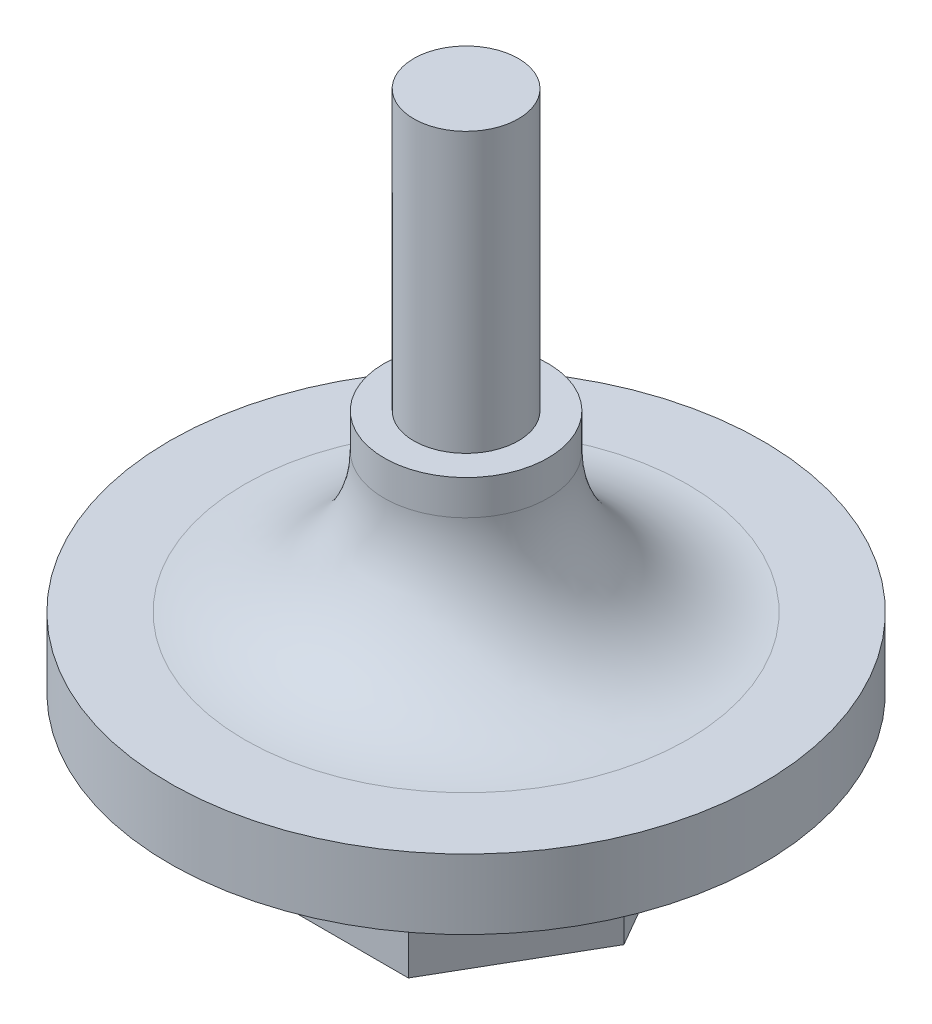
ISO-10303-21;
HEADER;
FILE_DESCRIPTION(('STEP AP214'),'2;1');
FILE_NAME('part.step','',(''),(''),'','','');
FILE_SCHEMA(('AUTOMOTIVE_DESIGN { 1 0 10303 214 1 1 1 1 }'));
ENDSEC;
DATA;
#1=APPLICATION_CONTEXT('core data for automotive mechanical design processes');
#2=APPLICATION_PROTOCOL_DEFINITION('international standard','automotive_design',2000,#1);
#3=PRODUCT_CONTEXT('',#1,'mechanical');
#4=PRODUCT('Part','Part','',(#3));
#5=PRODUCT_RELATED_PRODUCT_CATEGORY('part','',(#4));
#6=PRODUCT_DEFINITION_FORMATION('','',#4);
#7=PRODUCT_DEFINITION_CONTEXT('part definition',#1,'design');
#8=PRODUCT_DEFINITION('design','',#6,#7);
#9=PRODUCT_DEFINITION_SHAPE('','',#8);
#10=(LENGTH_UNIT() NAMED_UNIT(*) SI_UNIT(.MILLI.,.METRE.));
#11=(NAMED_UNIT(*) PLANE_ANGLE_UNIT() SI_UNIT($,.RADIAN.));
#12=(NAMED_UNIT(*) SI_UNIT($,.STERADIAN.) SOLID_ANGLE_UNIT());
#13=UNCERTAINTY_MEASURE_WITH_UNIT(LENGTH_MEASURE(1.E-05),#10,'distance_accuracy_value','');
#14=(GEOMETRIC_REPRESENTATION_CONTEXT(3) GLOBAL_UNCERTAINTY_ASSIGNED_CONTEXT((#13)) GLOBAL_UNIT_ASSIGNED_CONTEXT((#10,
#11,#12)) REPRESENTATION_CONTEXT('',''));
#15=CARTESIAN_POINT('',(0.,0.,0.));
#16=DIRECTION('',(0.,0.,1.));
#17=DIRECTION('',(1.,0.,0.));
#18=AXIS2_PLACEMENT_3D('',#15,#16,#17);
#19=CARTESIAN_POINT('',(0.,0.,0.));
#20=DIRECTION('',(0.,1.,0.));
#21=DIRECTION('',(-1.,0.,0.));
#22=AXIS2_PLACEMENT_3D('',#19,#20,#21);
#23=PLANE('',#22);
#24=CARTESIAN_POINT('',(0.,0.,0.));
#25=DIRECTION('',(0.,1.,0.));
#26=DIRECTION('',(-1.,0.,0.));
#27=AXIS2_PLACEMENT_3D('',#24,#25,#26);
#28=CIRCLE('',#27,13.5);
#29=CARTESIAN_POINT('',(-13.5,0.,0.));
#30=VERTEX_POINT('',#29);
#31=EDGE_CURVE('E111',#30,#30,#28,.T.);
#32=ORIENTED_EDGE('',*,*,#31,.F.);
#33=EDGE_LOOP('',(#32));
#34=FACE_BOUND('',#33,.T.);
#35=DIRECTION('',(0.5,0.,0.866025403784439));
#36=VECTOR('',#35,1.);
#37=CARTESIAN_POINT('',(3.59285072516704,0.,-6.223));
#38=LINE('',#37,#36);
#39=CARTESIAN_POINT('',(3.59285072516704,0.,-6.223));
#40=VERTEX_POINT('',#39);
#41=CARTESIAN_POINT('',(7.18570145033408,0.,0.));
#42=VERTEX_POINT('',#41);
#43=EDGE_CURVE('E53',#40,#42,#38,.T.);
#44=ORIENTED_EDGE('',*,*,#43,.F.);
#45=DIRECTION('',(1.,0.,0.));
#46=VECTOR('',#45,1.);
#47=CARTESIAN_POINT('',(-3.59285072516704,0.,-6.223));
#48=LINE('',#47,#46);
#49=CARTESIAN_POINT('',(-3.59285072516704,0.,-6.223));
#50=VERTEX_POINT('',#49);
#51=EDGE_CURVE('E57',#50,#40,#48,.T.);
#52=ORIENTED_EDGE('',*,*,#51,.F.);
#53=DIRECTION('',(0.5,0.,-0.866025403784438));
#54=VECTOR('',#53,1.);
#55=CARTESIAN_POINT('',(-7.18570145033408,0.,0.));
#56=LINE('',#55,#54);
#57=CARTESIAN_POINT('',(-7.18570145033408,0.,0.));
#58=VERTEX_POINT('',#57);
#59=EDGE_CURVE('E288',#58,#50,#56,.T.);
#60=ORIENTED_EDGE('',*,*,#59,.F.);
#61=DIRECTION('',(-0.5,0.,-0.866025403784438));
#62=VECTOR('',#61,1.);
#63=CARTESIAN_POINT('',(-3.59285072516704,0.,6.223));
#64=LINE('',#63,#62);
#65=CARTESIAN_POINT('',(-3.59285072516704,0.,6.223));
#66=VERTEX_POINT('',#65);
#67=EDGE_CURVE('E303',#66,#58,#64,.T.);
#68=ORIENTED_EDGE('',*,*,#67,.F.);
#69=DIRECTION('',(-1.,0.,0.));
#70=VECTOR('',#69,1.);
#71=CARTESIAN_POINT('',(3.59285072516704,0.,6.223));
#72=LINE('',#71,#70);
#73=CARTESIAN_POINT('',(3.59285072516704,0.,6.223));
#74=VERTEX_POINT('',#73);
#75=EDGE_CURVE('E306',#74,#66,#72,.T.);
#76=ORIENTED_EDGE('',*,*,#75,.F.);
#77=DIRECTION('',(-0.5,0.,0.866025403784438));
#78=VECTOR('',#77,1.);
#79=CARTESIAN_POINT('',(7.18570145033408,0.,0.));
#80=LINE('',#79,#78);
#81=EDGE_CURVE('E307',#42,#74,#80,.T.);
#82=ORIENTED_EDGE('',*,*,#81,.F.);
#83=EDGE_LOOP('',(#44,#52,#60,#68,#76,#82));
#84=FACE_BOUND('',#83,.T.);
#85=ADVANCED_FACE('F38',(#34,#84),#23,.F.);
#86=CARTESIAN_POINT('',(2.38125,23.8125,0.));
#87=DIRECTION('',(0.,-1.,0.));
#88=DIRECTION('',(1.,0.,0.));
#89=AXIS2_PLACEMENT_3D('',#86,#87,#88);
#90=PLANE('',#89);
#91=CARTESIAN_POINT('',(0.,23.8125,0.));
#92=DIRECTION('',(0.,1.,0.));
#93=DIRECTION('',(-1.,0.,0.));
#94=AXIS2_PLACEMENT_3D('',#91,#92,#93);
#95=CIRCLE('',#94,2.38125000000001);
#96=CARTESIAN_POINT('',(-2.38125000000001,23.8125,0.));
#97=VERTEX_POINT('',#96);
#98=EDGE_CURVE('E11',#97,#97,#95,.T.);
#99=ORIENTED_EDGE('',*,*,#98,.T.);
#100=EDGE_LOOP('',(#99));
#101=FACE_BOUND('',#100,.T.);
#102=ADVANCED_FACE('F40',(#101),#90,.F.);
#103=CARTESIAN_POINT('',(0.,23.8125,0.));
#104=DIRECTION('',(0.,1.,0.));
#105=DIRECTION('',(-1.,0.,0.));
#106=AXIS2_PLACEMENT_3D('',#103,#104,#105);
#107=CYLINDRICAL_SURFACE('',#106,2.38125000000001);
#108=ORIENTED_EDGE('',*,*,#98,.F.);
#109=EDGE_LOOP('',(#108));
#110=FACE_BOUND('',#109,.T.);
#111=CARTESIAN_POINT('',(0.,11.1125,0.));
#112=DIRECTION('',(0.,1.,0.));
#113=DIRECTION('',(-1.,0.,0.));
#114=AXIS2_PLACEMENT_3D('',#111,#112,#113);
#115=CIRCLE('',#114,2.38125000000001);
#116=CARTESIAN_POINT('',(-2.38125000000001,11.1125,0.));
#117=VERTEX_POINT('',#116);
#118=EDGE_CURVE('E46',#117,#117,#115,.T.);
#119=ORIENTED_EDGE('',*,*,#118,.T.);
#120=EDGE_LOOP('',(#119));
#121=FACE_BOUND('',#120,.T.);
#122=ADVANCED_FACE('F133',(#110,#121),#107,.T.);
#123=CARTESIAN_POINT('',(3.73,11.1125,0.));
#124=DIRECTION('',(0.,-1.,0.));
#125=DIRECTION('',(1.,0.,0.));
#126=AXIS2_PLACEMENT_3D('',#123,#124,#125);
#127=PLANE('',#126);
#128=ORIENTED_EDGE('',*,*,#118,.F.);
#129=EDGE_LOOP('',(#128));
#130=FACE_BOUND('',#129,.T.);
#131=CARTESIAN_POINT('',(0.,11.1125,0.));
#132=DIRECTION('',(0.,1.,0.));
#133=DIRECTION('',(-1.,0.,0.));
#134=AXIS2_PLACEMENT_3D('',#131,#132,#133);
#135=CIRCLE('',#134,3.73);
#136=CARTESIAN_POINT('',(-3.73,11.1125,0.));
#137=VERTEX_POINT('',#136);
#138=EDGE_CURVE('E128',#137,#137,#135,.T.);
#139=ORIENTED_EDGE('',*,*,#138,.T.);
#140=EDGE_LOOP('',(#139));
#141=FACE_BOUND('',#140,.T.);
#142=ADVANCED_FACE('F135',(#130,#141),#127,.F.);
#143=CARTESIAN_POINT('',(0.,23.8125,0.));
#144=DIRECTION('',(0.,1.,0.));
#145=DIRECTION('',(-1.,0.,0.));
#146=AXIS2_PLACEMENT_3D('',#143,#144,#145);
#147=CYLINDRICAL_SURFACE('',#146,3.73);
#148=ORIENTED_EDGE('',*,*,#138,.F.);
#149=EDGE_LOOP('',(#148));
#150=FACE_BOUND('',#149,.T.);
#151=CARTESIAN_POINT('',(0.,9.525,0.));
#152=DIRECTION('',(0.,1.,0.));
#153=DIRECTION('',(-1.,0.,0.));
#154=AXIS2_PLACEMENT_3D('',#151,#152,#153);
#155=CIRCLE('',#154,3.73);
#156=CARTESIAN_POINT('',(-3.73,9.525,0.));
#157=VERTEX_POINT('',#156);
#158=EDGE_CURVE('E125',#157,#157,#155,.T.);
#159=ORIENTED_EDGE('',*,*,#158,.T.);
#160=EDGE_LOOP('',(#159));
#161=FACE_BOUND('',#160,.T.);
#162=ADVANCED_FACE('F138',(#150,#161),#147,.T.);
#163=CARTESIAN_POINT('',(0.,9.525,0.));
#164=DIRECTION('',(0.,1.,0.));
#165=DIRECTION('',(-1.,0.,0.));
#166=AXIS2_PLACEMENT_3D('',#163,#164,#165);
#167=TOROIDAL_SURFACE('',#166,10.08,6.35);
#168=ORIENTED_EDGE('',*,*,#158,.F.);
#169=EDGE_LOOP('',(#168));
#170=FACE_BOUND('',#169,.T.);
#171=CARTESIAN_POINT('',(0.,3.175,0.));
#172=DIRECTION('',(0.,1.,0.));
#173=DIRECTION('',(-1.,0.,0.));
#174=AXIS2_PLACEMENT_3D('',#171,#172,#173);
#175=CIRCLE('',#174,10.08);
#176=CARTESIAN_POINT('',(-10.08,3.175,0.));
#177=VERTEX_POINT('',#176);
#178=EDGE_CURVE('E122',#177,#177,#175,.T.);
#179=ORIENTED_EDGE('',*,*,#178,.T.);
#180=EDGE_LOOP('',(#179));
#181=FACE_BOUND('',#180,.T.);
#182=ADVANCED_FACE('F144',(#170,#181),#167,.F.);
#183=CARTESIAN_POINT('',(13.5,3.175,0.));
#184=DIRECTION('',(0.,-1.,0.));
#185=DIRECTION('',(1.,0.,0.));
#186=AXIS2_PLACEMENT_3D('',#183,#184,#185);
#187=PLANE('',#186);
#188=ORIENTED_EDGE('',*,*,#178,.F.);
#189=EDGE_LOOP('',(#188));
#190=FACE_BOUND('',#189,.T.);
#191=CARTESIAN_POINT('',(0.,3.175,0.));
#192=DIRECTION('',(0.,1.,0.));
#193=DIRECTION('',(-1.,0.,0.));
#194=AXIS2_PLACEMENT_3D('',#191,#192,#193);
#195=CIRCLE('',#194,13.5);
#196=CARTESIAN_POINT('',(-13.5,3.175,0.));
#197=VERTEX_POINT('',#196);
#198=EDGE_CURVE('E114',#197,#197,#195,.T.);
#199=ORIENTED_EDGE('',*,*,#198,.T.);
#200=EDGE_LOOP('',(#199));
#201=FACE_BOUND('',#200,.T.);
#202=ADVANCED_FACE('F150',(#190,#201),#187,.F.);
#203=CARTESIAN_POINT('',(0.,23.8125,0.));
#204=DIRECTION('',(0.,1.,0.));
#205=DIRECTION('',(-1.,0.,0.));
#206=AXIS2_PLACEMENT_3D('',#203,#204,#205);
#207=CYLINDRICAL_SURFACE('',#206,13.5);
#208=ORIENTED_EDGE('',*,*,#198,.F.);
#209=EDGE_LOOP('',(#208));
#210=FACE_BOUND('',#209,.T.);
#211=ORIENTED_EDGE('',*,*,#31,.T.);
#212=EDGE_LOOP('',(#211));
#213=FACE_BOUND('',#212,.T.);
#214=ADVANCED_FACE('F156',(#210,#213),#207,.T.);
#215=CARTESIAN_POINT('',(3.59285072516704,-6.35,-6.223));
#216=DIRECTION('',(-0.866025403784439,0.,0.5));
#217=DIRECTION('',(0.5,0.,0.866025403784439));
#218=AXIS2_PLACEMENT_3D('',#215,#216,#217);
#219=PLANE('',#218);
#220=ORIENTED_EDGE('',*,*,#43,.T.);
#221=DIRECTION('',(0.,1.,0.));
#222=VECTOR('',#221,1.);
#223=CARTESIAN_POINT('',(7.18570145033408,-6.35,0.));
#224=LINE('',#223,#222);
#225=CARTESIAN_POINT('',(7.18570145033408,-6.35,0.));
#226=VERTEX_POINT('',#225);
#227=EDGE_CURVE('E94',#226,#42,#224,.T.);
#228=ORIENTED_EDGE('',*,*,#227,.F.);
#229=DIRECTION('',(0.5,0.,0.866025403784439));
#230=VECTOR('',#229,1.);
#231=CARTESIAN_POINT('',(3.59285072516704,-6.35,-6.223));
#232=LINE('',#231,#230);
#233=CARTESIAN_POINT('',(3.59285072516704,-6.35,-6.223));
#234=VERTEX_POINT('',#233);
#235=EDGE_CURVE('E100',#234,#226,#232,.T.);
#236=ORIENTED_EDGE('',*,*,#235,.F.);
#237=DIRECTION('',(0.,1.,0.));
#238=VECTOR('',#237,1.);
#239=CARTESIAN_POINT('',(3.59285072516704,-6.35,-6.223));
#240=LINE('',#239,#238);
#241=EDGE_CURVE('E285',#234,#40,#240,.T.);
#242=ORIENTED_EDGE('',*,*,#241,.T.);
#243=EDGE_LOOP('',(#220,#228,#236,#242));
#244=FACE_BOUND('',#243,.T.);
#245=ADVANCED_FACE('F110',(#244),#219,.F.);
#246=CARTESIAN_POINT('',(7.18570145033408,-6.35,0.));
#247=DIRECTION('',(-0.866025403784438,0.,-0.5));
#248=DIRECTION('',(-0.5,0.,0.866025403784438));
#249=AXIS2_PLACEMENT_3D('',#246,#247,#248);
#250=PLANE('',#249);
#251=ORIENTED_EDGE('',*,*,#81,.T.);
#252=DIRECTION('',(0.,1.,0.));
#253=VECTOR('',#252,1.);
#254=CARTESIAN_POINT('',(3.59285072516704,-6.35,6.223));
#255=LINE('',#254,#253);
#256=CARTESIAN_POINT('',(3.59285072516704,-6.35,6.223));
#257=VERTEX_POINT('',#256);
#258=EDGE_CURVE('E96',#257,#74,#255,.T.);
#259=ORIENTED_EDGE('',*,*,#258,.F.);
#260=DIRECTION('',(-0.5,0.,0.866025403784438));
#261=VECTOR('',#260,1.);
#262=CARTESIAN_POINT('',(7.18570145033408,-6.35,0.));
#263=LINE('',#262,#261);
#264=EDGE_CURVE('E89',#226,#257,#263,.T.);
#265=ORIENTED_EDGE('',*,*,#264,.F.);
#266=ORIENTED_EDGE('',*,*,#227,.T.);
#267=EDGE_LOOP('',(#251,#259,#265,#266));
#268=FACE_BOUND('',#267,.T.);
#269=ADVANCED_FACE('F92',(#268),#250,.F.);
#270=CARTESIAN_POINT('',(3.59285072516704,-6.35,6.223));
#271=DIRECTION('',(0.,0.,-1.));
#272=DIRECTION('',(-1.,0.,0.));
#273=AXIS2_PLACEMENT_3D('',#270,#271,#272);
#274=PLANE('',#273);
#275=ORIENTED_EDGE('',*,*,#75,.T.);
#276=DIRECTION('',(0.,1.,0.));
#277=VECTOR('',#276,1.);
#278=CARTESIAN_POINT('',(-3.59285072516704,-6.35,6.223));
#279=LINE('',#278,#277);
#280=CARTESIAN_POINT('',(-3.59285072516704,-6.35,6.223));
#281=VERTEX_POINT('',#280);
#282=EDGE_CURVE('E116',#281,#66,#279,.T.);
#283=ORIENTED_EDGE('',*,*,#282,.F.);
#284=DIRECTION('',(-1.,0.,0.));
#285=VECTOR('',#284,1.);
#286=CARTESIAN_POINT('',(3.59285072516704,-6.35,6.223));
#287=LINE('',#286,#285);
#288=EDGE_CURVE('E99',#257,#281,#287,.T.);
#289=ORIENTED_EDGE('',*,*,#288,.F.);
#290=ORIENTED_EDGE('',*,*,#258,.T.);
#291=EDGE_LOOP('',(#275,#283,#289,#290));
#292=FACE_BOUND('',#291,.T.);
#293=ADVANCED_FACE('F211',(#292),#274,.F.);
#294=CARTESIAN_POINT('',(-3.59285072516704,-6.35,6.223));
#295=DIRECTION('',(0.866025403784438,0.,-0.5));
#296=DIRECTION('',(-0.5,0.,-0.866025403784439));
#297=AXIS2_PLACEMENT_3D('',#294,#295,#296);
#298=PLANE('',#297);
#299=ORIENTED_EDGE('',*,*,#67,.T.);
#300=DIRECTION('',(0.,1.,0.));
#301=VECTOR('',#300,1.);
#302=CARTESIAN_POINT('',(-7.18570145033408,-6.35,0.));
#303=LINE('',#302,#301);
#304=CARTESIAN_POINT('',(-7.18570145033408,-6.35,0.));
#305=VERTEX_POINT('',#304);
#306=EDGE_CURVE('E291',#305,#58,#303,.T.);
#307=ORIENTED_EDGE('',*,*,#306,.F.);
#308=DIRECTION('',(-0.5,0.,-0.866025403784438));
#309=VECTOR('',#308,1.);
#310=CARTESIAN_POINT('',(-3.59285072516704,-6.35,6.223));
#311=LINE('',#310,#309);
#312=EDGE_CURVE('E304',#281,#305,#311,.T.);
#313=ORIENTED_EDGE('',*,*,#312,.F.);
#314=ORIENTED_EDGE('',*,*,#282,.T.);
#315=EDGE_LOOP('',(#299,#307,#313,#314));
#316=FACE_BOUND('',#315,.T.);
#317=ADVANCED_FACE('F217',(#316),#298,.F.);
#318=CARTESIAN_POINT('',(-7.18570145033408,-6.35,0.));
#319=DIRECTION('',(0.866025403784438,0.,0.5));
#320=DIRECTION('',(0.5,0.,-0.866025403784438));
#321=AXIS2_PLACEMENT_3D('',#318,#319,#320);
#322=PLANE('',#321);
#323=ORIENTED_EDGE('',*,*,#59,.T.);
#324=DIRECTION('',(0.,1.,0.));
#325=VECTOR('',#324,1.);
#326=CARTESIAN_POINT('',(-3.59285072516704,-6.35,-6.223));
#327=LINE('',#326,#325);
#328=CARTESIAN_POINT('',(-3.59285072516704,-6.35,-6.223));
#329=VERTEX_POINT('',#328);
#330=EDGE_CURVE('E287',#329,#50,#327,.T.);
#331=ORIENTED_EDGE('',*,*,#330,.F.);
#332=DIRECTION('',(0.5,0.,-0.866025403784438));
#333=VECTOR('',#332,1.);
#334=CARTESIAN_POINT('',(-7.18570145033408,-6.35,0.));
#335=LINE('',#334,#333);
#336=EDGE_CURVE('E293',#305,#329,#335,.T.);
#337=ORIENTED_EDGE('',*,*,#336,.F.);
#338=ORIENTED_EDGE('',*,*,#306,.T.);
#339=EDGE_LOOP('',(#323,#331,#337,#338));
#340=FACE_BOUND('',#339,.T.);
#341=ADVANCED_FACE('F225',(#340),#322,.F.);
#342=CARTESIAN_POINT('',(-3.59285072516704,-6.35,-6.223));
#343=DIRECTION('',(0.,0.,1.));
#344=DIRECTION('',(1.,0.,0.));
#345=AXIS2_PLACEMENT_3D('',#342,#343,#344);
#346=PLANE('',#345);
#347=ORIENTED_EDGE('',*,*,#51,.T.);
#348=ORIENTED_EDGE('',*,*,#241,.F.);
#349=DIRECTION('',(1.,0.,0.));
#350=VECTOR('',#349,1.);
#351=CARTESIAN_POINT('',(-3.59285072516704,-6.35,-6.223));
#352=LINE('',#351,#350);
#353=EDGE_CURVE('E105',#329,#234,#352,.T.);
#354=ORIENTED_EDGE('',*,*,#353,.F.);
#355=ORIENTED_EDGE('',*,*,#330,.T.);
#356=EDGE_LOOP('',(#347,#348,#354,#355));
#357=FACE_BOUND('',#356,.T.);
#358=ADVANCED_FACE('F233',(#357),#346,.F.);
#359=CARTESIAN_POINT('',(0.,-6.35,0.));
#360=DIRECTION('',(0.,-1.,0.));
#361=DIRECTION('',(1.,0.,0.));
#362=AXIS2_PLACEMENT_3D('',#359,#360,#361);
#363=PLANE('',#362);
#364=ORIENTED_EDGE('',*,*,#235,.T.);
#365=ORIENTED_EDGE('',*,*,#264,.T.);
#366=ORIENTED_EDGE('',*,*,#288,.T.);
#367=ORIENTED_EDGE('',*,*,#312,.T.);
#368=ORIENTED_EDGE('',*,*,#336,.T.);
#369=ORIENTED_EDGE('',*,*,#353,.T.);
#370=EDGE_LOOP('',(#364,#365,#366,#367,#368,#369));
#371=FACE_BOUND('',#370,.T.);
#372=ADVANCED_FACE('F103',(#371),#363,.T.);
#373=CLOSED_SHELL('',(#85,#102,#122,#142,#162,#182,#202,#214,#245,#269,#293,#317,#341,#358,#372));
#374=MANIFOLD_SOLID_BREP('B2',#373);
#375=ADVANCED_BREP_SHAPE_REPRESENTATION('',(#18,#374),#14);
#376=SHAPE_DEFINITION_REPRESENTATION(#9,#375);
ENDSEC;
END-ISO-10303-21;
